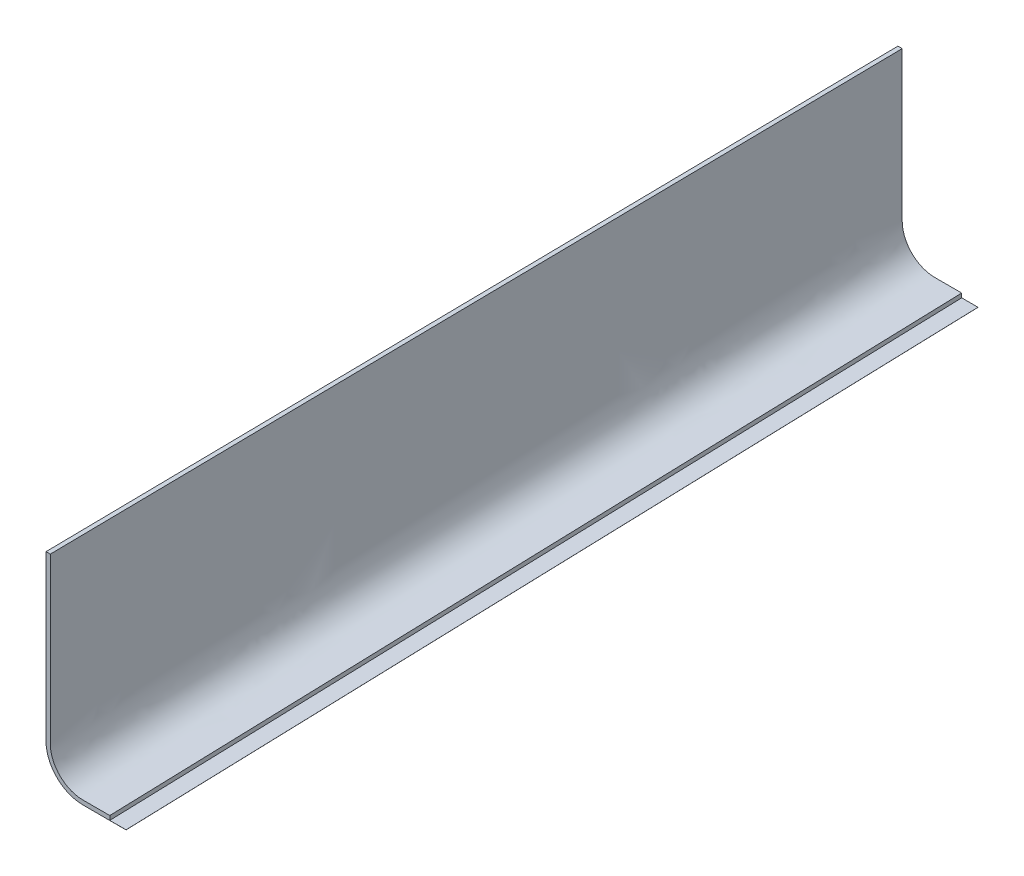
ISO-10303-21;
HEADER;
FILE_DESCRIPTION(('STEP AP214'),'2;1');
FILE_NAME('part.step','',(''),(''),'','','');
FILE_SCHEMA(('AUTOMOTIVE_DESIGN { 1 0 10303 214 1 1 1 1 }'));
ENDSEC;
DATA;
#1=APPLICATION_CONTEXT('core data for automotive mechanical design processes');
#2=APPLICATION_PROTOCOL_DEFINITION('international standard','automotive_design',2000,#1);
#3=PRODUCT_CONTEXT('',#1,'mechanical');
#4=PRODUCT('Part','Part','',(#3));
#5=PRODUCT_RELATED_PRODUCT_CATEGORY('part','',(#4));
#6=PRODUCT_DEFINITION_FORMATION('','',#4);
#7=PRODUCT_DEFINITION_CONTEXT('part definition',#1,'design');
#8=PRODUCT_DEFINITION('design','',#6,#7);
#9=PRODUCT_DEFINITION_SHAPE('','',#8);
#10=(LENGTH_UNIT() NAMED_UNIT(*) SI_UNIT(.MILLI.,.METRE.));
#11=(NAMED_UNIT(*) PLANE_ANGLE_UNIT() SI_UNIT($,.RADIAN.));
#12=(NAMED_UNIT(*) SI_UNIT($,.STERADIAN.) SOLID_ANGLE_UNIT());
#13=UNCERTAINTY_MEASURE_WITH_UNIT(LENGTH_MEASURE(1.E-05),#10,'distance_accuracy_value','');
#14=(GEOMETRIC_REPRESENTATION_CONTEXT(3) GLOBAL_UNCERTAINTY_ASSIGNED_CONTEXT((#13)) GLOBAL_UNIT_ASSIGNED_CONTEXT((#10,
#11,#12)) REPRESENTATION_CONTEXT('',''));
#15=CARTESIAN_POINT('',(0.,0.,0.));
#16=DIRECTION('',(0.,0.,1.));
#17=DIRECTION('',(1.,0.,0.));
#18=AXIS2_PLACEMENT_3D('',#15,#16,#17);
#19=CARTESIAN_POINT('',(-444.447797557808,-229.69048438311,-2052.91158045471));
#20=DIRECTION('',(0.,0.,-1.));
#21=DIRECTION('',(-1.,0.,0.));
#22=AXIS2_PLACEMENT_3D('',#19,#20,#21);
#23=PLANE('',#22);
#24=DIRECTION('',(-1.,0.,0.));
#25=VECTOR('',#24,1.);
#26=CARTESIAN_POINT('',(-520.647797557808,119.55951561689,-2052.91158045471));
#27=LINE('',#26,#25);
#28=CARTESIAN_POINT('',(-520.647797557808,119.55951561689,-2052.91158045471));
#29=VERTEX_POINT('',#28);
#30=CARTESIAN_POINT('',(-530.647797557808,119.55951561689,-2052.91158045471));
#31=VERTEX_POINT('',#30);
#32=EDGE_CURVE('E369',#29,#31,#27,.T.);
#33=ORIENTED_EDGE('',*,*,#32,.F.);
#34=DIRECTION('',(0.,-1.,0.));
#35=VECTOR('',#34,1.);
#36=CARTESIAN_POINT('',(-520.647797557808,119.55951561689,-2052.91158045471));
#37=LINE('',#36,#35);
#38=CARTESIAN_POINT('',(-520.647797557808,-229.69048438311,-2052.91158045471));
#39=VERTEX_POINT('',#38);
#40=EDGE_CURVE('E13',#29,#39,#37,.T.);
#41=ORIENTED_EDGE('',*,*,#40,.T.);
#42=CARTESIAN_POINT('',(-444.447797557808,-229.69048438311,-2052.91158045471));
#43=DIRECTION('',(0.,0.,-1.));
#44=DIRECTION('',(-1.,0.,0.));
#45=AXIS2_PLACEMENT_3D('',#42,#43,#44);
#46=CIRCLE('',#45,76.2);
#47=CARTESIAN_POINT('',(-444.447797557808,-305.89048438311,-2052.91158045471));
#48=VERTEX_POINT('',#47);
#49=EDGE_CURVE('E283',#48,#39,#46,.T.);
#50=ORIENTED_EDGE('',*,*,#49,.F.);
#51=DIRECTION('',(1.,0.,0.));
#52=VECTOR('',#51,1.);
#53=CARTESIAN_POINT('',(-444.447797557808,-305.89048438311,-2052.91158045471));
#54=LINE('',#53,#52);
#55=CARTESIAN_POINT('',(-381.540050678528,-305.89048438311,-2052.91158045471));
#56=VERTEX_POINT('',#55);
#57=EDGE_CURVE('E636',#48,#56,#54,.T.);
#58=ORIENTED_EDGE('',*,*,#57,.T.);
#59=DIRECTION('',(0.,1.,0.));
#60=VECTOR('',#59,1.);
#61=CARTESIAN_POINT('',(-381.540050678528,-315.690484383109,-2052.91158045471));
#62=LINE('',#61,#60);
#63=CARTESIAN_POINT('',(-381.540050678528,-315.690484383109,-2052.91158045471));
#64=VERTEX_POINT('',#63);
#65=EDGE_CURVE('E627',#64,#56,#62,.T.);
#66=ORIENTED_EDGE('',*,*,#65,.F.);
#67=DIRECTION('',(-1.,0.,0.));
#68=VECTOR('',#67,1.);
#69=CARTESIAN_POINT('',(-343.440050678528,-315.690484383109,-2052.91158045471));
#70=LINE('',#69,#68);
#71=CARTESIAN_POINT('',(-343.440050678528,-315.690484383109,-2052.91158045471));
#72=VERTEX_POINT('',#71);
#73=EDGE_CURVE('E618',#72,#64,#70,.T.);
#74=ORIENTED_EDGE('',*,*,#73,.F.);
#75=DIRECTION('',(2.7755575615632E-13,1.,0.));
#76=VECTOR('',#75,1.);
#77=CARTESIAN_POINT('',(-343.440050678528,-315.890484383109,-2052.91158045471));
#78=LINE('',#77,#76);
#79=CARTESIAN_POINT('',(-343.440050678528,-315.890484383109,-2052.91158045471));
#80=VERTEX_POINT('',#79);
#81=EDGE_CURVE('E609',#80,#72,#78,.T.);
#82=ORIENTED_EDGE('',*,*,#81,.F.);
#83=DIRECTION('',(1.,0.,0.));
#84=VECTOR('',#83,1.);
#85=CARTESIAN_POINT('',(-364.070454388012,-315.89048438311,-2052.91158045471));
#86=LINE('',#85,#84);
#87=CARTESIAN_POINT('',(-364.070454388012,-315.89048438311,-2052.91158045471));
#88=VERTEX_POINT('',#87);
#89=EDGE_CURVE('E600',#88,#80,#86,.T.);
#90=ORIENTED_EDGE('',*,*,#89,.F.);
#91=DIRECTION('',(1.,0.,0.));
#92=VECTOR('',#91,1.);
#93=CARTESIAN_POINT('',(-444.447797557808,-315.89048438311,-2052.91158045471));
#94=LINE('',#93,#92);
#95=CARTESIAN_POINT('',(-444.447797557808,-315.89048438311,-2052.91158045471));
#96=VERTEX_POINT('',#95);
#97=EDGE_CURVE('E579',#96,#88,#94,.T.);
#98=ORIENTED_EDGE('',*,*,#97,.F.);
#99=CARTESIAN_POINT('',(-444.447797557808,-229.69048438311,-2052.91158045471));
#100=DIRECTION('',(0.,0.,-1.));
#101=DIRECTION('',(-1.,0.,0.));
#102=AXIS2_PLACEMENT_3D('',#99,#100,#101);
#103=CIRCLE('',#102,86.2);
#104=CARTESIAN_POINT('',(-530.647797557808,-229.69048438311,-2052.91158045471));
#105=VERTEX_POINT('',#104);
#106=EDGE_CURVE('E576',#96,#105,#103,.T.);
#107=ORIENTED_EDGE('',*,*,#106,.T.);
#108=DIRECTION('',(0.,-1.,0.));
#109=VECTOR('',#108,1.);
#110=CARTESIAN_POINT('',(-530.647797557808,119.55951561689,-2052.91158045471));
#111=LINE('',#110,#109);
#112=EDGE_CURVE('E565',#31,#105,#111,.T.);
#113=ORIENTED_EDGE('',*,*,#112,.F.);
#114=EDGE_LOOP('',(#33,#41,#50,#58,#66,#74,#82,#90,#98,#107,#113));
#115=FACE_BOUND('',#114,.T.);
#116=ADVANCED_FACE('F272',(#115),#23,.T.);
#117=CARTESIAN_POINT('',(-383.521789204399,-230.782639429518,0.));
#118=DIRECTION('',(0.,0.,1.));
#119=DIRECTION('',(1.,0.,0.));
#120=AXIS2_PLACEMENT_3D('',#117,#118,#119);
#121=PLANE('',#120);
#122=DIRECTION('',(0.,-1.,0.));
#123=VECTOR('',#122,1.);
#124=CARTESIAN_POINT('',(-469.721789204399,152.757360570421,0.));
#125=LINE('',#124,#123);
#126=CARTESIAN_POINT('',(-469.721789204399,152.757360570421,0.));
#127=VERTEX_POINT('',#126);
#128=CARTESIAN_POINT('',(-469.721789204398,142.757360569808,0.));
#129=VERTEX_POINT('',#128);
#130=EDGE_CURVE('E487',#127,#129,#125,.T.);
#131=ORIENTED_EDGE('',*,*,#130,.T.);
#132=DIRECTION('',(0.,-1.,0.));
#133=VECTOR('',#132,1.);
#134=CARTESIAN_POINT('',(-469.721789204399,142.757360570421,0.));
#135=LINE('',#134,#133);
#136=CARTESIAN_POINT('',(-469.721789204398,-230.78263942951,0.));
#137=VERTEX_POINT('',#136);
#138=EDGE_CURVE('E479',#129,#137,#135,.T.);
#139=ORIENTED_EDGE('',*,*,#138,.T.);
#140=CARTESIAN_POINT('',(-383.521789204399,-230.782639429518,0.));
#141=DIRECTION('',(0.,0.,1.));
#142=DIRECTION('',(1.,0.,0.));
#143=AXIS2_PLACEMENT_3D('',#140,#141,#142);
#144=CIRCLE('',#143,86.2);
#145=CARTESIAN_POINT('',(-383.521794930177,-316.988198241806,0.));
#146=VERTEX_POINT('',#145);
#147=EDGE_CURVE('E486',#137,#146,#144,.T.);
#148=ORIENTED_EDGE('',*,*,#147,.T.);
#149=DIRECTION('',(0.999998000005999,-0.00199999600055312,0.));
#150=VECTOR('',#149,1.);
#151=CARTESIAN_POINT('',(-383.521789204399,-316.982639429518,0.));
#152=LINE('',#151,#150);
#153=CARTESIAN_POINT('',(-320.627654739021,-317.104974073988,0.));
#154=VERTEX_POINT('',#153);
#155=EDGE_CURVE('E491',#146,#154,#152,.T.);
#156=ORIENTED_EDGE('',*,*,#155,.T.);
#157=DIRECTION('',(-1.,0.,0.));
#158=VECTOR('',#157,1.);
#159=CARTESIAN_POINT('',(-282.527675027662,-317.108427688626,0.));
#160=LINE('',#159,#158);
#161=CARTESIAN_POINT('',(-282.527675027662,-317.108427688626,0.));
#162=VERTEX_POINT('',#161);
#163=EDGE_CURVE('E708',#162,#154,#160,.T.);
#164=ORIENTED_EDGE('',*,*,#163,.F.);
#165=DIRECTION('',(0.,1.,0.));
#166=VECTOR('',#165,1.);
#167=CARTESIAN_POINT('',(-282.527675027662,-317.108427688626,0.));
#168=LINE('',#167,#166);
#169=CARTESIAN_POINT('',(-282.527675027662,-316.908427688626,0.));
#170=VERTEX_POINT('',#169);
#171=EDGE_CURVE('E690',#162,#170,#168,.T.);
#172=ORIENTED_EDGE('',*,*,#171,.T.);
#173=DIRECTION('',(-1.,0.,0.));
#174=VECTOR('',#173,1.);
#175=CARTESIAN_POINT('',(-282.527675027662,-316.908427688626,0.));
#176=LINE('',#175,#174);
#177=CARTESIAN_POINT('',(-320.627659667512,-316.908427688626,0.));
#178=VERTEX_POINT('',#177);
#179=EDGE_CURVE('E709',#170,#178,#176,.T.);
#180=ORIENTED_EDGE('',*,*,#179,.T.);
#181=DIRECTION('',(0.,-1.,0.));
#182=VECTOR('',#181,1.);
#183=CARTESIAN_POINT('',(-320.627659667512,-307.642639429531,0.));
#184=LINE('',#183,#182);
#185=CARTESIAN_POINT('',(-320.627659667512,-307.642639429532,0.));
#186=VERTEX_POINT('',#185);
#187=EDGE_CURVE('E719',#186,#178,#184,.T.);
#188=ORIENTED_EDGE('',*,*,#187,.F.);
#189=DIRECTION('',(0.,1.,0.));
#190=VECTOR('',#189,1.);
#191=CARTESIAN_POINT('',(-320.627659667512,-307.642639429531,0.));
#192=LINE('',#191,#190);
#193=CARTESIAN_POINT('',(-320.627659667512,-306.982639429518,0.));
#194=VERTEX_POINT('',#193);
#195=EDGE_CURVE('E725',#186,#194,#192,.T.);
#196=ORIENTED_EDGE('',*,*,#195,.T.);
#197=DIRECTION('',(1.,0.,0.));
#198=VECTOR('',#197,1.);
#199=CARTESIAN_POINT('',(-383.521789204399,-306.982639429518,0.));
#200=LINE('',#199,#198);
#201=CARTESIAN_POINT('',(-383.521789204223,-306.982639429518,0.));
#202=VERTEX_POINT('',#201);
#203=EDGE_CURVE('E728',#202,#194,#200,.T.);
#204=ORIENTED_EDGE('',*,*,#203,.F.);
#205=CARTESIAN_POINT('',(-383.521789204399,-230.782639429518,0.));
#206=DIRECTION('',(0.,0.,1.));
#207=DIRECTION('',(1.,0.,0.));
#208=AXIS2_PLACEMENT_3D('',#205,#206,#207);
#209=CIRCLE('',#208,76.2000000000001);
#210=CARTESIAN_POINT('',(-459.721789204399,-230.782639429515,0.));
#211=VERTEX_POINT('',#210);
#212=EDGE_CURVE('E388',#211,#202,#209,.T.);
#213=ORIENTED_EDGE('',*,*,#212,.F.);
#214=DIRECTION('',(0.,-1.,0.));
#215=VECTOR('',#214,1.);
#216=CARTESIAN_POINT('',(-459.721789204399,152.757360570421,0.));
#217=LINE('',#216,#215);
#218=CARTESIAN_POINT('',(-459.721789204399,152.757360570421,0.));
#219=VERTEX_POINT('',#218);
#220=EDGE_CURVE('E365',#219,#211,#217,.T.);
#221=ORIENTED_EDGE('',*,*,#220,.F.);
#222=DIRECTION('',(-1.,0.,0.));
#223=VECTOR('',#222,1.);
#224=CARTESIAN_POINT('',(-459.721789204399,152.757360570421,0.));
#225=LINE('',#224,#223);
#226=EDGE_CURVE('E373',#219,#127,#225,.T.);
#227=ORIENTED_EDGE('',*,*,#226,.T.);
#228=EDGE_LOOP('',(#131,#139,#148,#156,#164,#172,#180,#188,#196,#204,#213,#221,#227));
#229=FACE_BOUND('',#228,.T.);
#230=ADVANCED_FACE('F386',(#229),#121,.T.);
#231=CARTESIAN_POINT('',(-469.721789204399,152.757360570421,0.));
#232=DIRECTION('',(0.,0.999869273349889,-0.0161689891695756));
#233=DIRECTION('',(1.,0.,0.));
#234=AXIS2_PLACEMENT_3D('',#231,#232,#233);
#235=PLANE('',#234);
#236=ORIENTED_EDGE('',*,*,#226,.F.);
#237=CARTESIAN_POINT('',(-459.721789204399,152.757360570421,0.));
#238=CARTESIAN_POINT('',(-480.030458655535,141.691412252577,-684.303860151571));
#239=CARTESIAN_POINT('',(-500.339128106671,130.625463934734,-1368.60772030314));
#240=CARTESIAN_POINT('',(-520.647797557808,119.55951561689,-2052.91158045471));
#241=B_SPLINE_CURVE_WITH_KNOTS('',3,(#237,#238,#239,#240),.UNSPECIFIED.,.F.,.F.,(4,4),(0.,1.),.UNSPECIFIED.);
#242=EDGE_CURVE('E291',#219,#29,#241,.T.);
#243=ORIENTED_EDGE('',*,*,#242,.T.);
#244=ORIENTED_EDGE('',*,*,#32,.T.);
#245=CARTESIAN_POINT('',(-469.721789204399,152.757360570421,0.));
#246=CARTESIAN_POINT('',(-490.030458655535,141.691412252577,-684.303860151571));
#247=CARTESIAN_POINT('',(-510.339128106671,130.625463934734,-1368.60772030314));
#248=CARTESIAN_POINT('',(-530.647797557808,119.55951561689,-2052.91158045471));
#249=B_SPLINE_CURVE_WITH_KNOTS('',3,(#245,#246,#247,#248),.UNSPECIFIED.,.F.,.F.,(4,4),(0.,1.),.UNSPECIFIED.);
#250=EDGE_CURVE('E370',#127,#31,#249,.T.);
#251=ORIENTED_EDGE('',*,*,#250,.F.);
#252=EDGE_LOOP('',(#236,#243,#244,#251));
#253=FACE_BOUND('',#252,.T.);
#254=ADVANCED_FACE('F375',(#253),#235,.T.);
#255=CARTESIAN_POINT('',(-282.527675027662,-317.108427688626,0.));
#256=CARTESIAN_POINT('',(-302.831800244618,-316.702446586787,-684.303860151571));
#257=CARTESIAN_POINT('',(-323.135925461573,-316.296465484948,-1368.60772030314));
#258=CARTESIAN_POINT('',(-343.440050678528,-315.890484383109,-2052.91158045471));
#259=CARTESIAN_POINT('',(-285.697567154222,-317.108427688626,0.));
#260=CARTESIAN_POINT('',(-305.519736677059,-316.702446586787,-684.303860151571));
#261=CARTESIAN_POINT('',(-325.341906199896,-316.296465484948,-1368.60772030314));
#262=CARTESIAN_POINT('',(-345.164075722733,-315.89048438311,-2052.91158045471));
#263=CARTESIAN_POINT('',(-292.573970143898,-317.108427688626,0.));
#264=CARTESIAN_POINT('',(-311.176221945595,-316.702446586787,-684.303860151571));
#265=CARTESIAN_POINT('',(-329.778473747292,-316.296465484948,-1368.60772030314));
#266=CARTESIAN_POINT('',(-348.380725548989,-315.890484383109,-2052.91158045471));
#267=CARTESIAN_POINT('',(-303.360142480982,-317.108427688625,0.));
#268=CARTESIAN_POINT('',(-319.91087287977,-316.702446586787,-684.303860151571));
#269=CARTESIAN_POINT('',(-336.461603278558,-316.296465484948,-1368.60772030314));
#270=CARTESIAN_POINT('',(-353.012333677345,-315.89048438311,-2052.91158045471));
#271=CARTESIAN_POINT('',(-312.909539558191,-317.108427688626,0.));
#272=CARTESIAN_POINT('',(-327.918010701025,-316.702446586787,-684.303860151572));
#273=CARTESIAN_POINT('',(-342.926481843859,-316.296465484948,-1368.60772030314));
#274=CARTESIAN_POINT('',(-357.934952986693,-315.890484383109,-2052.91158045472));
#275=CARTESIAN_POINT('',(-318.201385312253,-317.108427688626,0.));
#276=CARTESIAN_POINT('',(-332.682208722885,-316.702446586787,-684.303860151571));
#277=CARTESIAN_POINT('',(-347.163032133517,-316.296465484948,-1368.60772030314));
#278=CARTESIAN_POINT('',(-361.643855544148,-315.89048438311,-2052.91158045471));
#279=CARTESIAN_POINT('',(-326.617559996204,-317.096447887965,0.));
#280=CARTESIAN_POINT('',(-341.098762592165,-316.694460053013,-684.303860151571));
#281=CARTESIAN_POINT('',(-355.579965188127,-316.292472218061,-1368.60772030314));
#282=CARTESIAN_POINT('',(-370.061167784088,-315.89048438311,-2052.91158045471));
#283=CARTESIAN_POINT('',(-337.391464257669,-317.074900079437,0.));
#284=CARTESIAN_POINT('',(-352.529352225405,-316.680094847328,-684.303860151572));
#285=CARTESIAN_POINT('',(-367.667240193141,-316.285289615219,-1368.60772030314));
#286=CARTESIAN_POINT('',(-382.805128160877,-315.89048438311,-2052.91158045472));
#287=CARTESIAN_POINT('',(-352.390605755758,-317.044901796432,0.));
#288=CARTESIAN_POINT('',(-369.507771725706,-316.660095991991,-684.30386015157));
#289=CARTESIAN_POINT('',(-386.624937695653,-316.27529018755,-1368.60772030314));
#290=CARTESIAN_POINT('',(-403.742103665601,-315.890484383109,-2052.91158045471));
#291=CARTESIAN_POINT('',(-367.272010534551,-317.015138986867,0.));
#292=CARTESIAN_POINT('',(-386.513287285728,-316.640254118948,-684.303860151572));
#293=CARTESIAN_POINT('',(-405.754564036905,-316.265369251029,-1368.60772030314));
#294=CARTESIAN_POINT('',(-424.995840788082,-315.89048438311,-2052.91158045472));
#295=CARTESIAN_POINT('',(-377.791265777207,-316.994100476376,0.));
#296=CARTESIAN_POINT('',(-397.93151820956,-316.626228445287,-684.303860151571));
#297=CARTESIAN_POINT('',(-418.071770641913,-316.258356414198,-1368.60772030314));
#298=CARTESIAN_POINT('',(-438.212023074267,-315.89048438311,-2052.91158045471));
#299=CARTESIAN_POINT('',(-388.918892504115,-316.982639429518,0.));
#300=CARTESIAN_POINT('',(-409.386176019512,-316.618587747382,-684.303860151571));
#301=CARTESIAN_POINT('',(-429.853459534908,-316.254536065246,-1368.60772030314));
#302=CARTESIAN_POINT('',(-450.320743050304,-315.89048438311,-2052.91158045471));
#303=CARTESIAN_POINT('',(-399.784450186618,-315.965985269253,0.));
#304=CARTESIAN_POINT('',(-420.521045237828,-315.539579690633,-684.303860151571));
#305=CARTESIAN_POINT('',(-441.257640289038,-315.113174112014,-1368.60772030314));
#306=CARTESIAN_POINT('',(-461.994235340248,-314.686768533394,-2052.91158045471));
#307=CARTESIAN_POINT('',(-415.698175387881,-311.327953648391,0.));
#308=CARTESIAN_POINT('',(-436.664180620169,-310.706783326329,-684.303860151571));
#309=CARTESIAN_POINT('',(-457.630185852457,-310.085613004267,-1368.60772030314));
#310=CARTESIAN_POINT('',(-478.596191084745,-309.464442682204,-2052.91158045471));
#311=CARTESIAN_POINT('',(-430.604462221074,-303.640202815496,0.));
#312=CARTESIAN_POINT('',(-451.626649660792,-302.806919038348,-684.303860151571));
#313=CARTESIAN_POINT('',(-472.64883710051,-301.9736352612,-1368.60772030314));
#314=CARTESIAN_POINT('',(-493.671024540228,-301.140351484052,-2052.91158045471));
#315=CARTESIAN_POINT('',(-443.886133578956,-293.09760477958,0.));
#316=CARTESIAN_POINT('',(-464.81981533879,-292.106983675635,-684.303860151571));
#317=CARTESIAN_POINT('',(-485.753497098623,-291.116362571691,-1368.60772030314));
#318=CARTESIAN_POINT('',(-506.687178858456,-290.125741467747,-2052.91158045471));
#319=CARTESIAN_POINT('',(-454.961371986121,-280.029828993522,0.));
#320=CARTESIAN_POINT('',(-475.711943235875,-278.989967074306,-684.303860151572));
#321=CARTESIAN_POINT('',(-496.462514485629,-277.95010515509,-1368.60772030314));
#322=CARTESIAN_POINT('',(-517.213085735384,-276.910243235874,-2052.91158045472));
#323=CARTESIAN_POINT('',(-463.315143653692,-264.89451229305,0.));
#324=CARTESIAN_POINT('',(-483.851562930018,-263.942865139659,-684.30386015157));
#325=CARTESIAN_POINT('',(-504.387982206343,-262.991217986267,-1368.60772030314));
#326=CARTESIAN_POINT('',(-524.924401482669,-262.039570832876,-2052.91158045471));
#327=CARTESIAN_POINT('',(-468.531263412419,-248.263466961807,0.));
#328=CARTESIAN_POINT('',(-488.890592126569,-247.540561068603,-684.303860151571));
#329=CARTESIAN_POINT('',(-509.24992084072,-246.817655175399,-1368.60772030314));
#330=CARTESIAN_POINT('',(-529.609249554871,-246.094749282195,-2052.91158045471));
#331=CARTESIAN_POINT('',(-469.721789204398,-236.621418394141,0.));
#332=CARTESIAN_POINT('',(-490.030458655535,-236.129656426876,-684.303860151571));
#333=CARTESIAN_POINT('',(-510.339128106671,-235.63789445961,-1368.60772030314));
#334=CARTESIAN_POINT('',(-530.647797557807,-235.146132492345,-2052.91158045471));
#335=CARTESIAN_POINT('',(-469.721789204399,-200.048310487275,0.));
#336=CARTESIAN_POINT('',(-490.030458655535,-200.35650379613,-684.303860151571));
#337=CARTESIAN_POINT('',(-510.339128106671,-200.664697104985,-1368.60772030314));
#338=CARTESIAN_POINT('',(-530.647797557808,-200.972890413841,-2052.91158045471));
#339=CARTESIAN_POINT('',(-469.721789204398,-138.194327868642,0.));
#340=CARTESIAN_POINT('',(-490.030458655535,-140.102355186354,-684.303860151571));
#341=CARTESIAN_POINT('',(-510.339128106671,-142.010382504067,-1368.60772030314));
#342=CARTESIAN_POINT('',(-530.647797557808,-143.918409821779,-2052.91158045471));
#343=CARTESIAN_POINT('',(-469.721789204399,-44.664207023178,0.));
#344=CARTESIAN_POINT('',(-490.030458655535,-49.4508832871727,-684.303860151571));
#345=CARTESIAN_POINT('',(-510.339128106671,-54.2375595511674,-1368.60772030314));
#346=CARTESIAN_POINT('',(-530.647797557807,-59.0242358151621,-2052.91158045471));
#347=CARTESIAN_POINT('',(-469.721789204399,49.1721961705914,0.));
#348=CARTESIAN_POINT('',(-490.030458655535,41.315019080607,-684.303860151572));
#349=CARTESIAN_POINT('',(-510.339128106671,33.4578419906226,-1368.60772030314));
#350=CARTESIAN_POINT('',(-530.647797557808,25.6006649006382,-2052.91158045472));
#351=CARTESIAN_POINT('',(-469.721789204399,111.629027237092,0.));
#352=CARTESIAN_POINT('',(-490.030458655535,101.788757727194,-684.303860151571));
#353=CARTESIAN_POINT('',(-510.339128106671,91.9484882172951,-1368.60772030314));
#354=CARTESIAN_POINT('',(-530.647797557808,82.1082187073966,-2052.91158045471));
#355=CARTESIAN_POINT('',(-469.721789204398,143.590693903754,0.));
#356=CARTESIAN_POINT('',(-490.030458655535,132.797924393857,-684.303860151571));
#357=CARTESIAN_POINT('',(-510.339128106671,122.00515488396,-1368.60772030314));
#358=CARTESIAN_POINT('',(-530.647797557808,111.212385374063,-2052.91158045471));
#359=CARTESIAN_POINT('',(-469.721789204398,145.267459391258,0.));
#360=CARTESIAN_POINT('',(-490.030458655534,134.418659186724,-684.303860151572));
#361=CARTESIAN_POINT('',(-510.339128106671,123.56985898219,-1368.60772030314));
#362=CARTESIAN_POINT('',(-530.647797557807,112.721058777655,-2052.91158045472));
#363=CARTESIAN_POINT('',(-469.721789204399,147.790281407485,0.));
#364=CARTESIAN_POINT('',(-490.030458655536,136.852657228809,-684.303860151571));
#365=CARTESIAN_POINT('',(-510.339128106672,125.915033050133,-1368.60772030314));
#366=CARTESIAN_POINT('',(-530.647797557808,114.977408871458,-2052.91158045471));
#367=CARTESIAN_POINT('',(-469.721789204398,150.297375621672,0.));
#368=CARTESIAN_POINT('',(-490.030458655534,139.28050327866,-684.303860151571));
#369=CARTESIAN_POINT('',(-510.339128106671,128.263630935648,-1368.60772030314));
#370=CARTESIAN_POINT('',(-530.647797557807,117.246758592636,-2052.91158045471));
#371=CARTESIAN_POINT('',(-469.721789204398,151.943632308535,0.));
#372=CARTESIAN_POINT('',(-490.030458655535,140.889809080686,-684.303860151571));
#373=CARTESIAN_POINT('',(-510.339128106671,129.835985852838,-1368.60772030314));
#374=CARTESIAN_POINT('',(-530.647797557808,118.78216262499,-2052.91158045471));
#375=CARTESIAN_POINT('',(-469.721789204399,152.757360570421,0.));
#376=CARTESIAN_POINT('',(-490.030458655535,141.691412252577,-684.303860151571));
#377=CARTESIAN_POINT('',(-510.339128106671,130.625463934734,-1368.60772030314));
#378=CARTESIAN_POINT('',(-530.647797557808,119.55951561689,-2052.91158045471));
#379=B_SPLINE_SURFACE_WITH_KNOTS('',3,3,((#255,#256,#257,#258),(#259,#260,#261,#262),(#263,#264,
#265,#266),(#267,#268,#269,#270),(#271,#272,#273,#274),(#275,#276,#277,#278),(#279,#280,#281,
#282),(#283,#284,#285,#286),(#287,#288,#289,#290),(#291,#292,#293,#294),(#295,#296,#297,#298),
(#299,#300,#301,#302),(#303,#304,#305,#306),(#307,#308,#309,#310),(#311,#312,#313,#314),(#315,
#316,#317,#318),(#319,#320,#321,#322),(#323,#324,#325,#326),(#327,#328,#329,#330),(#331,#332,
#333,#334),(#335,#336,#337,#338),(#339,#340,#341,#342),(#343,#344,#345,#346),(#347,#348,#349,
#350),(#351,#352,#353,#354),(#355,#356,#357,#358),(#359,#360,#361,#362),(#363,#364,#365,#366),
(#367,#368,#369,#370),(#371,#372,#373,#374),(#375,#376,#377,#378)),.UNSPECIFIED.,.F.,.F.,.F.,(4,
1,1,1,2,1,1,1,2,1,1,1,1,1,1,1,2,1,1,1,2,1,1,1,4),(4,4),(0.493528864528762,0.499549922168165,
0.505570979807568,0.51159203744697,0.517613095086373,0.532477698994897,0.547342302903421,
0.562206906811945,0.577071510720469,0.59107121666249,0.605070922604512,0.619070628546533,
0.633070334488554,0.647070040430576,0.661069746372597,0.675069452314619,0.68906915825664,
0.762761203686708,0.836453249116775,0.910145294546843,0.98383733997691,0.985810141964116,
0.987782943951322,0.989755745938527,0.991728547925733),(0.,1.),.UNSPECIFIED.);
#380=CARTESIAN_POINT('',(-282.527675027662,-317.108427688626,0.));
#381=CARTESIAN_POINT('',(-302.831800244618,-316.702446586787,-684.303860151571));
#382=CARTESIAN_POINT('',(-323.135925461573,-316.296465484948,-1368.60772030314));
#383=CARTESIAN_POINT('',(-343.440050678528,-315.890484383109,-2052.91158045471));
#384=B_SPLINE_CURVE_WITH_KNOTS('',3,(#380,#381,#382,#383),.UNSPECIFIED.,.F.,.F.,(4,4),(0.,1.),.UNSPECIFIED.);
#385=EDGE_CURVE('E684',#162,#80,#384,.T.);
#386=ORIENTED_EDGE('',*,*,#163,.T.);
#387=ORIENTED_EDGE('',*,*,#155,.F.);
#388=ORIENTED_EDGE('',*,*,#147,.F.);
#389=ORIENTED_EDGE('',*,*,#138,.F.);
#390=ORIENTED_EDGE('',*,*,#130,.F.);
#391=ORIENTED_EDGE('',*,*,#250,.T.);
#392=ORIENTED_EDGE('',*,*,#112,.T.);
#393=ORIENTED_EDGE('',*,*,#106,.F.);
#394=ORIENTED_EDGE('',*,*,#97,.T.);
#395=ORIENTED_EDGE('',*,*,#89,.T.);
#396=ORIENTED_EDGE('',*,*,#385,.F.);
#397=EDGE_LOOP('',(#386,#387,#388,#389,#390,#391,#392,#393,#394,#395,#396));
#398=FACE_BOUND('',#397,.T.);
#399=ADVANCED_FACE('F498',(#398),#379,.T.);
#400=CARTESIAN_POINT('',(-282.527675027662,-316.908427688626,0.));
#401=DIRECTION('',(0.999560100014127,2.77433659383185E-13,-0.0296581600870464));
#402=DIRECTION('',(2.77555756156397E-13,-1.,0.));
#403=AXIS2_PLACEMENT_3D('',#400,#401,#402);
#404=PLANE('',#403);
#405=ORIENTED_EDGE('',*,*,#171,.F.);
#406=ORIENTED_EDGE('',*,*,#385,.T.);
#407=ORIENTED_EDGE('',*,*,#81,.T.);
#408=CARTESIAN_POINT('',(-282.527675027662,-316.908427688626,0.));
#409=CARTESIAN_POINT('',(-302.831800244618,-316.502446586787,-684.303860151571));
#410=CARTESIAN_POINT('',(-323.135925461573,-316.096465484948,-1368.60772030314));
#411=CARTESIAN_POINT('',(-343.440050678528,-315.690484383109,-2052.91158045471));
#412=B_SPLINE_CURVE_WITH_KNOTS('',3,(#408,#409,#410,#411),.UNSPECIFIED.,.F.,.F.,(4,4),(0.,1.),.UNSPECIFIED.);
#413=EDGE_CURVE('E692',#170,#72,#412,.T.);
#414=ORIENTED_EDGE('',*,*,#413,.F.);
#415=EDGE_LOOP('',(#405,#406,#407,#414));
#416=FACE_BOUND('',#415,.T.);
#417=ADVANCED_FACE('F518',(#416),#404,.T.);
#418=CARTESIAN_POINT('',(-320.627659667512,-316.908427688626,0.));
#419=DIRECTION('',(0.,0.999999824011801,0.000593275961209604));
#420=DIRECTION('',(1.,0.,0.));
#421=AXIS2_PLACEMENT_3D('',#418,#419,#420);
#422=PLANE('',#421);
#423=ORIENTED_EDGE('',*,*,#179,.F.);
#424=ORIENTED_EDGE('',*,*,#413,.T.);
#425=ORIENTED_EDGE('',*,*,#73,.T.);
#426=CARTESIAN_POINT('',(-320.627659667512,-316.908427688626,0.));
#427=CARTESIAN_POINT('',(-340.931790004517,-316.502446586787,-684.303860151571));
#428=CARTESIAN_POINT('',(-361.235920341523,-316.096465484948,-1368.60772030314));
#429=CARTESIAN_POINT('',(-381.540050678528,-315.690484383109,-2052.91158045471));
#430=B_SPLINE_CURVE_WITH_KNOTS('',3,(#426,#427,#428,#429),.UNSPECIFIED.,.F.,.F.,(4,4),(0.,1.),.UNSPECIFIED.);
#431=EDGE_CURVE('E695',#178,#64,#430,.T.);
#432=ORIENTED_EDGE('',*,*,#431,.F.);
#433=EDGE_LOOP('',(#423,#424,#425,#432));
#434=FACE_BOUND('',#433,.T.);
#435=ADVANCED_FACE('F755',(#434),#422,.T.);
#436=CARTESIAN_POINT('',(-320.627659667512,-306.982639429518,0.));
#437=DIRECTION('',(0.999560099792416,0.,-0.0296581675593063));
#438=DIRECTION('',(0.,-1.,0.));
#439=AXIS2_PLACEMENT_3D('',#436,#437,#438);
#440=PLANE('',#439);
#441=ORIENTED_EDGE('',*,*,#195,.F.);
#442=ORIENTED_EDGE('',*,*,#187,.T.);
#443=ORIENTED_EDGE('',*,*,#431,.T.);
#444=ORIENTED_EDGE('',*,*,#65,.T.);
#445=CARTESIAN_POINT('',(-320.627659667512,-306.982639429518,0.));
#446=CARTESIAN_POINT('',(-340.931790004517,-306.618587747382,-684.303860151571));
#447=CARTESIAN_POINT('',(-361.235920341523,-306.254536065246,-1368.60772030314));
#448=CARTESIAN_POINT('',(-381.540050678528,-305.89048438311,-2052.91158045471));
#449=B_SPLINE_CURVE_WITH_KNOTS('',3,(#445,#446,#447,#448),.UNSPECIFIED.,.F.,.F.,(4,4),(0.,1.),.UNSPECIFIED.);
#450=EDGE_CURVE('E381',#194,#56,#449,.T.);
#451=ORIENTED_EDGE('',*,*,#450,.F.);
#452=EDGE_LOOP('',(#441,#442,#443,#444,#451));
#453=FACE_BOUND('',#452,.T.);
#454=ADVANCED_FACE('F274',(#453),#440,.T.);
#455=CARTESIAN_POINT('',(-459.721789204399,152.757360570421,0.));
#456=CARTESIAN_POINT('',(-480.030458655535,141.691412252577,-684.303860151571));
#457=CARTESIAN_POINT('',(-500.339128106671,130.625463934734,-1368.60772030314));
#458=CARTESIAN_POINT('',(-520.647797557808,119.55951561689,-2052.91158045471));
#459=CARTESIAN_POINT('',(-459.721789204398,120.834780524826,0.));
#460=CARTESIAN_POINT('',(-480.030458655535,110.695993588089,-684.303860151571));
#461=CARTESIAN_POINT('',(-500.339128106671,100.557206651352,-1368.60772030314));
#462=CARTESIAN_POINT('',(-520.647797557808,90.4184197146149,-2052.91158045471));
#463=CARTESIAN_POINT('',(-459.721789204399,56.7674389629783,0.));
#464=CARTESIAN_POINT('',(-480.030458655535,48.6257316588286,-684.303860151571));
#465=CARTESIAN_POINT('',(-500.339128106671,40.4840243546788,-1368.60772030314));
#466=CARTESIAN_POINT('',(-520.647797557807,32.342317050529,-2052.91158045471));
#467=CARTESIAN_POINT('',(-459.721789204398,-39.5468248557362,0.));
#468=CARTESIAN_POINT('',(-480.030458655535,-44.5572725509112,-684.303860151572));
#469=CARTESIAN_POINT('',(-500.339128106672,-49.5677202460863,-1368.60772030314));
#470=CARTESIAN_POINT('',(-520.647797557808,-54.5781679412613,-2052.91158045472));
#471=CARTESIAN_POINT('',(-459.721789204399,-135.610027274292,0.));
#472=CARTESIAN_POINT('',(-480.030458655535,-137.646520512497,-684.303860151571));
#473=CARTESIAN_POINT('',(-500.339128106671,-139.683013750703,-1368.60772030314));
#474=CARTESIAN_POINT('',(-520.647797557807,-141.719506988909,-2052.91158045471));
#475=CARTESIAN_POINT('',(-459.721789204399,-199.183135344937,0.));
#476=CARTESIAN_POINT('',(-480.030458655535,-199.536805127493,-684.303860151571));
#477=CARTESIAN_POINT('',(-500.339128106671,-199.890474910048,-1368.60772030314));
#478=CARTESIAN_POINT('',(-520.647797557808,-200.244144692603,-2052.91158045471));
#479=CARTESIAN_POINT('',(-459.721789204399,-235.950999024504,0.));
#480=CARTESIAN_POINT('',(-480.030458655535,-235.469558075478,-684.303860151571));
#481=CARTESIAN_POINT('',(-500.339128106671,-234.988117126452,-1368.60772030314));
#482=CARTESIAN_POINT('',(-520.647797557808,-234.506676177426,-2052.91158045471));
#483=CARTESIAN_POINT('',(-458.668477338591,-246.189028154192,0.));
#484=CARTESIAN_POINT('',(-479.022790371155,-245.532723058332,-684.303860151574));
#485=CARTESIAN_POINT('',(-499.377103403719,-244.876417962471,-1368.60772030315));
#486=CARTESIAN_POINT('',(-519.731416436284,-244.22011286661,-2052.91158045472));
#487=CARTESIAN_POINT('',(-454.138588340337,-260.710164463906,0.));
#488=CARTESIAN_POINT('',(-474.603237542888,-259.9592276698,-684.303860151568));
#489=CARTESIAN_POINT('',(-495.06788674544,-259.208290875694,-1368.60772030314));
#490=CARTESIAN_POINT('',(-515.532535947991,-258.457354081588,-2052.9115804547));
#491=CARTESIAN_POINT('',(-446.92992942676,-273.915289300363,0.));
#492=CARTESIAN_POINT('',(-467.478372977037,-273.196259605463,-684.303860151574));
#493=CARTESIAN_POINT('',(-488.026816527313,-272.477229910563,-1368.60772030315));
#494=CARTESIAN_POINT('',(-508.57526007759,-271.758200215663,-2052.91158045472));
#495=CARTESIAN_POINT('',(-437.365285122449,-285.381368720172,0.));
#496=CARTESIAN_POINT('',(-457.934344648848,-284.765627032301,-684.303860151569));
#497=CARTESIAN_POINT('',(-478.503404175247,-284.149885344431,-1368.60772030314));
#498=CARTESIAN_POINT('',(-499.072463701645,-283.534143656561,-2052.91158045471));
#499=CARTESIAN_POINT('',(-425.814695861214,-294.744196156747,0.));
#500=CARTESIAN_POINT('',(-446.336852715552,-294.247100679544,-684.303860151572));
#501=CARTESIAN_POINT('',(-466.859009569889,-293.750005202342,-1368.60772030314));
#502=CARTESIAN_POINT('',(-487.381166424226,-293.252909725139,-2052.91158045472));
#503=CARTESIAN_POINT('',(-412.689582772163,-301.698676078775,0.));
#504=CARTESIAN_POINT('',(-433.120886810924,-301.29210997275,-684.303860151571));
#505=CARTESIAN_POINT('',(-453.552190849685,-300.885543866725,-1368.60772030314));
#506=CARTESIAN_POINT('',(-473.983494888447,-300.4789777607,-2052.91158045471));
#507=CARTESIAN_POINT('',(-398.438795086417,-306.001690320539,0.));
#508=CARTESIAN_POINT('',(-418.777546692657,-305.636896605116,-684.303860151571));
#509=CARTESIAN_POINT('',(-439.116298298898,-305.272102889693,-1368.60772030314));
#510=CARTESIAN_POINT('',(-459.455049905138,-304.90730917427,-2052.91158045471));
#511=CARTESIAN_POINT('',(-388.508876264965,-306.982639429518,0.));
#512=CARTESIAN_POINT('',(-408.817669693892,-306.618587747382,-684.303860151571));
#513=CARTESIAN_POINT('',(-429.12646312282,-306.254536065246,-1368.60772030314));
#514=CARTESIAN_POINT('',(-449.435256551748,-305.89048438311,-2052.91158045471));
#515=CARTESIAN_POINT('',(-378.280229253874,-306.982639429518,0.));
#516=CARTESIAN_POINT('',(-398.588768401084,-306.618587747382,-684.303860151571));
#517=CARTESIAN_POINT('',(-418.897307548294,-306.254536065246,-1368.60772030314));
#518=CARTESIAN_POINT('',(-439.205846695504,-305.89048438311,-2052.91158045471));
#519=CARTESIAN_POINT('',(-367.79767226261,-306.982639429518,0.));
#520=CARTESIAN_POINT('',(-388.105585923424,-306.618587747382,-684.303860151572));
#521=CARTESIAN_POINT('',(-408.413499584238,-306.254536065246,-1368.60772030314));
#522=CARTESIAN_POINT('',(-428.721413245052,-305.89048438311,-2052.91158045472));
#523=CARTESIAN_POINT('',(-352.074689063288,-306.982639429519,0.));
#524=CARTESIAN_POINT('',(-372.381111892551,-306.618587747382,-684.30386015157));
#525=CARTESIAN_POINT('',(-392.687534721813,-306.254536065245,-1368.60772030314));
#526=CARTESIAN_POINT('',(-412.993957551075,-305.890484383109,-2052.91158045471));
#527=CARTESIAN_POINT('',(-336.351722186518,-306.982639429518,0.));
#528=CARTESIAN_POINT('',(-356.656643598874,-306.618587747382,-684.303860151571));
#529=CARTESIAN_POINT('',(-376.961565011229,-306.254536065246,-1368.60772030314));
#530=CARTESIAN_POINT('',(-397.266486423585,-305.89048438311,-2052.91158045471));
#531=CARTESIAN_POINT('',(-325.86919784601,-306.982639429518,0.));
#532=CARTESIAN_POINT('',(-346.173472601057,-306.618587747382,-684.303860151571));
#533=CARTESIAN_POINT('',(-366.477747356105,-306.254536065246,-1368.60772030314));
#534=CARTESIAN_POINT('',(-386.782022111152,-305.89048438311,-2052.91158045471));
#535=CARTESIAN_POINT('',(-320.627659667512,-306.982639429518,0.));
#536=CARTESIAN_POINT('',(-340.931790004517,-306.618587747382,-684.303860151571));
#537=CARTESIAN_POINT('',(-361.235920341523,-306.254536065246,-1368.60772030314));
#538=CARTESIAN_POINT('',(-381.540050678528,-305.89048438311,-2052.91158045471));
#539=B_SPLINE_SURFACE_WITH_KNOTS('',3,3,((#455,#456,#457,#458),(#459,#460,#461,#462),(#463,#464,
#465,#466),(#467,#468,#469,#470),(#471,#472,#473,#474),(#475,#476,#477,#478),(#479,#480,#481,
#482),(#483,#484,#485,#486),(#487,#488,#489,#490),(#491,#492,#493,#494),(#495,#496,#497,#498),
(#499,#500,#501,#502),(#503,#504,#505,#506),(#507,#508,#509,#510),(#511,#512,#513,#514),(#515,
#516,#517,#518),(#519,#520,#521,#522),(#523,#524,#525,#526),(#527,#528,#529,#530),(#531,#532,
#533,#534),(#535,#536,#537,#538)),.UNSPECIFIED.,.F.,.F.,.F.,(4,1,1,1,2,1,1,1,1,1,1,1,2,1,1,1,4),
(4,4),(0.,0.0756648474172732,0.151329694834546,0.22699454225182,0.302659389669093,
0.315034999794174,0.327410609919256,0.339786220044338,0.352161830169419,0.364537440294501,
0.376913050419582,0.389288660544664,0.401664270669745,0.414671363023473,0.4276784553772,
0.440685547730927,0.453692640084654),(0.,1.),.UNSPECIFIED.);
#540=ORIENTED_EDGE('',*,*,#220,.T.);
#541=ORIENTED_EDGE('',*,*,#212,.T.);
#542=ORIENTED_EDGE('',*,*,#203,.T.);
#543=ORIENTED_EDGE('',*,*,#450,.T.);
#544=ORIENTED_EDGE('',*,*,#57,.F.);
#545=ORIENTED_EDGE('',*,*,#49,.T.);
#546=ORIENTED_EDGE('',*,*,#40,.F.);
#547=ORIENTED_EDGE('',*,*,#242,.F.);
#548=EDGE_LOOP('',(#540,#541,#542,#543,#544,#545,#546,#547));
#549=FACE_BOUND('',#548,.T.);
#550=ADVANCED_FACE('F363',(#549),#539,.T.);
#551=CLOSED_SHELL('',(#116,#230,#254,#399,#417,#435,#454,#550));
#552=MANIFOLD_SOLID_BREP('B2',#551);
#553=ADVANCED_BREP_SHAPE_REPRESENTATION('',(#18,#552),#14);
#554=SHAPE_DEFINITION_REPRESENTATION(#9,#553);
ENDSEC;
END-ISO-10303-21;
